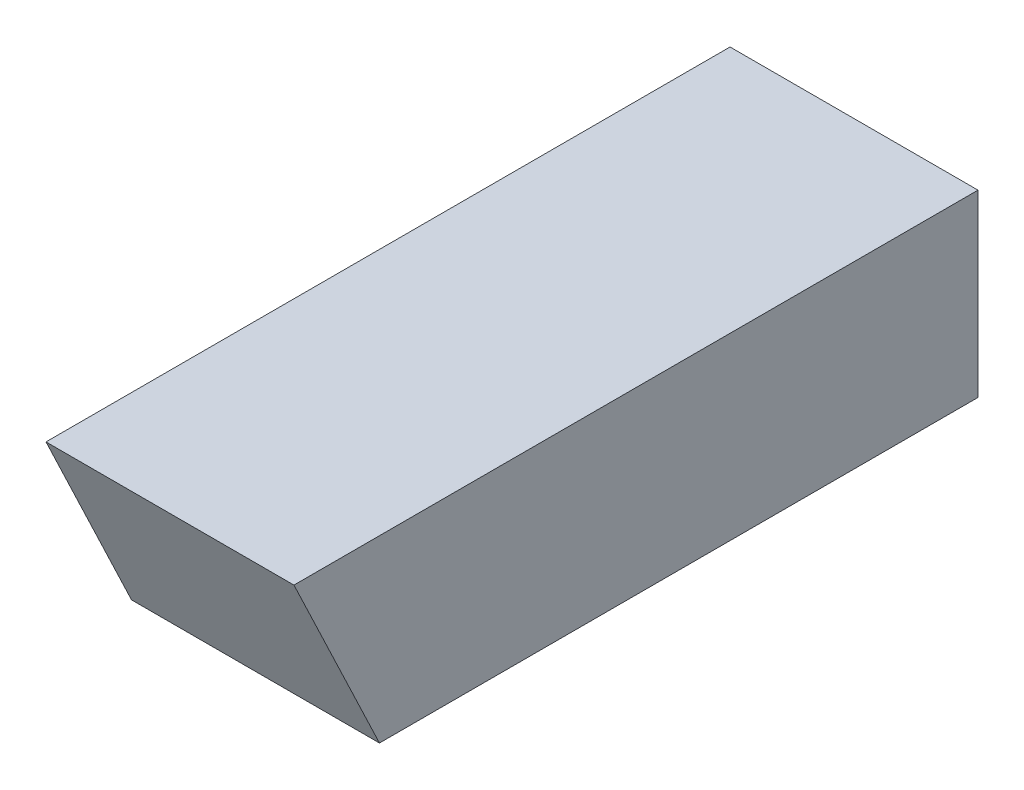
ISO-10303-21;
HEADER;
FILE_DESCRIPTION(('STEP AP214'),'2;1');
FILE_NAME('part.step','',(''),(''),'','','');
FILE_SCHEMA(('AUTOMOTIVE_DESIGN { 1 0 10303 214 1 1 1 1 }'));
ENDSEC;
DATA;
#1=APPLICATION_CONTEXT('core data for automotive mechanical design processes');
#2=APPLICATION_PROTOCOL_DEFINITION('international standard','automotive_design',2000,#1);
#3=PRODUCT_CONTEXT('',#1,'mechanical');
#4=PRODUCT('Part','Part','',(#3));
#5=PRODUCT_RELATED_PRODUCT_CATEGORY('part','',(#4));
#6=PRODUCT_DEFINITION_FORMATION('','',#4);
#7=PRODUCT_DEFINITION_CONTEXT('part definition',#1,'design');
#8=PRODUCT_DEFINITION('design','',#6,#7);
#9=PRODUCT_DEFINITION_SHAPE('','',#8);
#10=(LENGTH_UNIT() NAMED_UNIT(*) SI_UNIT(.MILLI.,.METRE.));
#11=(NAMED_UNIT(*) PLANE_ANGLE_UNIT() SI_UNIT($,.RADIAN.));
#12=(NAMED_UNIT(*) SI_UNIT($,.STERADIAN.) SOLID_ANGLE_UNIT());
#13=UNCERTAINTY_MEASURE_WITH_UNIT(LENGTH_MEASURE(1.E-05),#10,'distance_accuracy_value','');
#14=(GEOMETRIC_REPRESENTATION_CONTEXT(3) GLOBAL_UNCERTAINTY_ASSIGNED_CONTEXT((#13)) GLOBAL_UNIT_ASSIGNED_CONTEXT((#10,
#11,#12)) REPRESENTATION_CONTEXT('',''));
#15=CARTESIAN_POINT('',(0.,0.,0.));
#16=DIRECTION('',(0.,0.,1.));
#17=DIRECTION('',(1.,0.,0.));
#18=AXIS2_PLACEMENT_3D('',#15,#16,#17);
#19=CARTESIAN_POINT('',(145.,0.,350.));
#20=DIRECTION('',(0.,1.,0.));
#21=DIRECTION('',(0.,0.,1.));
#22=AXIS2_PLACEMENT_3D('',#19,#20,#21);
#23=PLANE('',#22);
#24=DIRECTION('',(0.,0.,-1.));
#25=VECTOR('',#24,1.);
#26=CARTESIAN_POINT('',(0.,0.,350.));
#27=LINE('',#26,#25);
#28=CARTESIAN_POINT('',(0.,0.,350.));
#29=VERTEX_POINT('',#28);
#30=CARTESIAN_POINT('',(0.,0.,0.));
#31=VERTEX_POINT('',#30);
#32=EDGE_CURVE('E166',#29,#31,#27,.T.);
#33=ORIENTED_EDGE('',*,*,#32,.T.);
#34=DIRECTION('',(-1.,0.,0.));
#35=VECTOR('',#34,1.);
#36=CARTESIAN_POINT('',(145.,0.,0.));
#37=LINE('',#36,#35);
#38=CARTESIAN_POINT('',(145.,0.,0.));
#39=VERTEX_POINT('',#38);
#40=EDGE_CURVE('E42',#39,#31,#37,.T.);
#41=ORIENTED_EDGE('',*,*,#40,.F.);
#42=DIRECTION('',(0.,0.,-1.));
#43=VECTOR('',#42,1.);
#44=CARTESIAN_POINT('',(145.,0.,350.));
#45=LINE('',#44,#43);
#46=CARTESIAN_POINT('',(145.,0.,350.));
#47=VERTEX_POINT('',#46);
#48=EDGE_CURVE('E156',#47,#39,#45,.T.);
#49=ORIENTED_EDGE('',*,*,#48,.F.);
#50=DIRECTION('',(-1.,0.,0.));
#51=VECTOR('',#50,1.);
#52=CARTESIAN_POINT('',(145.,0.,350.));
#53=LINE('',#52,#51);
#54=EDGE_CURVE('E11',#47,#29,#53,.T.);
#55=ORIENTED_EDGE('',*,*,#54,.T.);
#56=EDGE_LOOP('',(#33,#41,#49,#55));
#57=FACE_BOUND('',#56,.T.);
#58=CARTESIAN_POINT('',(72.5000000000003,0.,153.));
#59=DIRECTION('',(0.,-1.,0.));
#60=DIRECTION('',(0.,0.,-1.));
#61=AXIS2_PLACEMENT_3D('',#58,#59,#60);
#62=CIRCLE('',#61,2.55269999999996);
#63=CARTESIAN_POINT('',(72.5000000000003,0.,150.4473));
#64=VERTEX_POINT('',#63);
#65=EDGE_CURVE('E146',#64,#64,#62,.T.);
#66=ORIENTED_EDGE('',*,*,#65,.F.);
#67=EDGE_LOOP('',(#66));
#68=FACE_BOUND('',#67,.T.);
#69=CARTESIAN_POINT('',(72.5000000000002,0.,203.));
#70=DIRECTION('',(0.,-1.,0.));
#71=DIRECTION('',(0.,0.,-1.));
#72=AXIS2_PLACEMENT_3D('',#69,#70,#71);
#73=CIRCLE('',#72,2.55269999999996);
#74=CARTESIAN_POINT('',(72.5000000000002,0.,200.4473));
#75=VERTEX_POINT('',#74);
#76=EDGE_CURVE('E140',#75,#75,#73,.T.);
#77=ORIENTED_EDGE('',*,*,#76,.F.);
#78=EDGE_LOOP('',(#77));
#79=FACE_BOUND('',#78,.T.);
#80=CARTESIAN_POINT('',(72.5,0.,253.));
#81=DIRECTION('',(0.,-1.,0.));
#82=DIRECTION('',(0.,0.,-1.));
#83=AXIS2_PLACEMENT_3D('',#80,#81,#82);
#84=CIRCLE('',#83,2.55269999999996);
#85=CARTESIAN_POINT('',(72.5,0.,250.4473));
#86=VERTEX_POINT('',#85);
#87=EDGE_CURVE('E129',#86,#86,#84,.T.);
#88=ORIENTED_EDGE('',*,*,#87,.F.);
#89=EDGE_LOOP('',(#88));
#90=FACE_BOUND('',#89,.T.);
#91=DIRECTION('',(0.,0.,1.));
#92=VECTOR('',#91,1.);
#93=CARTESIAN_POINT('',(100.,0.,83.));
#94=LINE('',#93,#92);
#95=CARTESIAN_POINT('',(100.,0.,83.));
#96=VERTEX_POINT('',#95);
#97=CARTESIAN_POINT('',(100.,0.,113.));
#98=VERTEX_POINT('',#97);
#99=EDGE_CURVE('E128',#96,#98,#94,.T.);
#100=ORIENTED_EDGE('',*,*,#99,.F.);
#101=DIRECTION('',(1.,0.,0.));
#102=VECTOR('',#101,1.);
#103=CARTESIAN_POINT('',(45.,0.,83.));
#104=LINE('',#103,#102);
#105=CARTESIAN_POINT('',(45.,0.,83.));
#106=VERTEX_POINT('',#105);
#107=EDGE_CURVE('E125',#106,#96,#104,.T.);
#108=ORIENTED_EDGE('',*,*,#107,.F.);
#109=DIRECTION('',(0.,0.,-1.));
#110=VECTOR('',#109,1.);
#111=CARTESIAN_POINT('',(45.,0.,83.));
#112=LINE('',#111,#110);
#113=CARTESIAN_POINT('',(45.,0.,113.));
#114=VERTEX_POINT('',#113);
#115=EDGE_CURVE('E54',#114,#106,#112,.T.);
#116=ORIENTED_EDGE('',*,*,#115,.F.);
#117=DIRECTION('',(-1.,0.,0.));
#118=VECTOR('',#117,1.);
#119=CARTESIAN_POINT('',(45.,0.,113.));
#120=LINE('',#119,#118);
#121=EDGE_CURVE('E49',#98,#114,#120,.T.);
#122=ORIENTED_EDGE('',*,*,#121,.F.);
#123=EDGE_LOOP('',(#100,#108,#116,#122));
#124=FACE_BOUND('',#123,.T.);
#125=ADVANCED_FACE('F34',(#57,#68,#79,#90,#124),#23,.F.);
#126=CARTESIAN_POINT('',(145.,105.,400.));
#127=DIRECTION('',(0.,0.429933580392349,-0.90286051882393));
#128=DIRECTION('',(0.,0.90286051882393,0.429933580392349));
#129=AXIS2_PLACEMENT_3D('',#126,#127,#128);
#130=PLANE('',#129);
#131=DIRECTION('',(0.,-0.90286051882393,-0.429933580392349));
#132=VECTOR('',#131,1.);
#133=CARTESIAN_POINT('',(0.,105.,400.));
#134=LINE('',#133,#132);
#135=CARTESIAN_POINT('',(0.,105.,400.));
#136=VERTEX_POINT('',#135);
#137=EDGE_CURVE('E152',#136,#29,#134,.T.);
#138=ORIENTED_EDGE('',*,*,#137,.T.);
#139=ORIENTED_EDGE('',*,*,#54,.F.);
#140=DIRECTION('',(0.,-0.90286051882393,-0.429933580392349));
#141=VECTOR('',#140,1.);
#142=CARTESIAN_POINT('',(145.,105.,400.));
#143=LINE('',#142,#141);
#144=CARTESIAN_POINT('',(145.,105.,400.));
#145=VERTEX_POINT('',#144);
#146=EDGE_CURVE('E153',#145,#47,#143,.T.);
#147=ORIENTED_EDGE('',*,*,#146,.F.);
#148=DIRECTION('',(-1.,0.,0.));
#149=VECTOR('',#148,1.);
#150=CARTESIAN_POINT('',(145.,105.,400.));
#151=LINE('',#150,#149);
#152=EDGE_CURVE('E163',#145,#136,#151,.T.);
#153=ORIENTED_EDGE('',*,*,#152,.T.);
#154=EDGE_LOOP('',(#138,#139,#147,#153));
#155=FACE_BOUND('',#154,.T.);
#156=ADVANCED_FACE('F36',(#155),#130,.F.);
#157=CARTESIAN_POINT('',(145.,0.,0.));
#158=DIRECTION('',(0.,0.,1.));
#159=DIRECTION('',(1.,0.,0.));
#160=AXIS2_PLACEMENT_3D('',#157,#158,#159);
#161=PLANE('',#160);
#162=DIRECTION('',(0.,1.,0.));
#163=VECTOR('',#162,1.);
#164=CARTESIAN_POINT('',(0.,0.,0.));
#165=LINE('',#164,#163);
#166=CARTESIAN_POINT('',(0.,105.,0.));
#167=VERTEX_POINT('',#166);
#168=EDGE_CURVE('E168',#31,#167,#165,.T.);
#169=ORIENTED_EDGE('',*,*,#168,.T.);
#170=DIRECTION('',(-1.,0.,0.));
#171=VECTOR('',#170,1.);
#172=CARTESIAN_POINT('',(145.,105.,0.));
#173=LINE('',#172,#171);
#174=CARTESIAN_POINT('',(145.,105.,0.));
#175=VERTEX_POINT('',#174);
#176=EDGE_CURVE('E173',#175,#167,#173,.T.);
#177=ORIENTED_EDGE('',*,*,#176,.F.);
#178=DIRECTION('',(0.,1.,0.));
#179=VECTOR('',#178,1.);
#180=CARTESIAN_POINT('',(145.,0.,0.));
#181=LINE('',#180,#179);
#182=EDGE_CURVE('E159',#39,#175,#181,.T.);
#183=ORIENTED_EDGE('',*,*,#182,.F.);
#184=ORIENTED_EDGE('',*,*,#40,.T.);
#185=EDGE_LOOP('',(#169,#177,#183,#184));
#186=FACE_BOUND('',#185,.T.);
#187=ADVANCED_FACE('F180',(#186),#161,.F.);
#188=CARTESIAN_POINT('',(145.,105.,0.));
#189=DIRECTION('',(0.,-1.,0.));
#190=DIRECTION('',(0.,0.,-1.));
#191=AXIS2_PLACEMENT_3D('',#188,#189,#190);
#192=PLANE('',#191);
#193=DIRECTION('',(0.,0.,1.));
#194=VECTOR('',#193,1.);
#195=CARTESIAN_POINT('',(0.,105.,0.));
#196=LINE('',#195,#194);
#197=EDGE_CURVE('E157',#167,#136,#196,.T.);
#198=ORIENTED_EDGE('',*,*,#197,.T.);
#199=ORIENTED_EDGE('',*,*,#152,.F.);
#200=DIRECTION('',(0.,0.,1.));
#201=VECTOR('',#200,1.);
#202=CARTESIAN_POINT('',(145.,105.,0.));
#203=LINE('',#202,#201);
#204=EDGE_CURVE('E161',#175,#145,#203,.T.);
#205=ORIENTED_EDGE('',*,*,#204,.F.);
#206=ORIENTED_EDGE('',*,*,#176,.T.);
#207=EDGE_LOOP('',(#198,#199,#205,#206));
#208=FACE_BOUND('',#207,.T.);
#209=ADVANCED_FACE('F189',(#208),#192,.F.);
#210=CARTESIAN_POINT('',(145.,0.,0.));
#211=DIRECTION('',(1.,0.,0.));
#212=DIRECTION('',(0.,0.,-1.));
#213=AXIS2_PLACEMENT_3D('',#210,#211,#212);
#214=PLANE('',#213);
#215=ORIENTED_EDGE('',*,*,#146,.T.);
#216=ORIENTED_EDGE('',*,*,#48,.T.);
#217=ORIENTED_EDGE('',*,*,#182,.T.);
#218=ORIENTED_EDGE('',*,*,#204,.T.);
#219=EDGE_LOOP('',(#215,#216,#217,#218));
#220=FACE_BOUND('',#219,.T.);
#221=ADVANCED_FACE('F195',(#220),#214,.T.);
#222=CARTESIAN_POINT('',(0.,0.,0.));
#223=DIRECTION('',(1.,0.,0.));
#224=DIRECTION('',(0.,0.,-1.));
#225=AXIS2_PLACEMENT_3D('',#222,#223,#224);
#226=PLANE('',#225);
#227=ORIENTED_EDGE('',*,*,#137,.F.);
#228=ORIENTED_EDGE('',*,*,#197,.F.);
#229=ORIENTED_EDGE('',*,*,#168,.F.);
#230=ORIENTED_EDGE('',*,*,#32,.F.);
#231=EDGE_LOOP('',(#227,#228,#229,#230));
#232=FACE_BOUND('',#231,.T.);
#233=ADVANCED_FACE('F186',(#232),#226,.F.);
#234=CARTESIAN_POINT('',(72.5000000000003,8.00000000000001,153.));
#235=DIRECTION('',(0.,-1.,0.));
#236=DIRECTION('',(0.,0.,-1.));
#237=AXIS2_PLACEMENT_3D('',#234,#235,#236);
#238=CONICAL_SURFACE('',#237,2.55269999999996,1.02974425867665);
#239=CARTESIAN_POINT('',(72.5000000000003,9.53381690219165,153.));
#240=VERTEX_POINT('',#239);
#241=VERTEX_LOOP('',#240);
#242=FACE_BOUND('',#241,.T.);
#243=CARTESIAN_POINT('',(72.5000000000003,8.00000000000001,153.));
#244=DIRECTION('',(0.,-1.,0.));
#245=DIRECTION('',(0.,0.,-1.));
#246=AXIS2_PLACEMENT_3D('',#243,#244,#245);
#247=CIRCLE('',#246,2.55269999999996);
#248=CARTESIAN_POINT('',(72.5000000000003,8.00000000000001,150.4473));
#249=VERTEX_POINT('',#248);
#250=EDGE_CURVE('E149',#249,#249,#247,.T.);
#251=ORIENTED_EDGE('',*,*,#250,.T.);
#252=EDGE_LOOP('',(#251));
#253=FACE_BOUND('',#252,.T.);
#254=ADVANCED_FACE('F249',(#242,#253),#238,.F.);
#255=CARTESIAN_POINT('',(72.5000000000003,0.,153.));
#256=DIRECTION('',(0.,-1.,0.));
#257=DIRECTION('',(0.,0.,-1.));
#258=AXIS2_PLACEMENT_3D('',#255,#256,#257);
#259=CYLINDRICAL_SURFACE('',#258,2.55269999999996);
#260=ORIENTED_EDGE('',*,*,#250,.F.);
#261=EDGE_LOOP('',(#260));
#262=FACE_BOUND('',#261,.T.);
#263=ORIENTED_EDGE('',*,*,#65,.T.);
#264=EDGE_LOOP('',(#263));
#265=FACE_BOUND('',#264,.T.);
#266=ADVANCED_FACE('F245',(#262,#265),#259,.F.);
#267=CARTESIAN_POINT('',(72.5000000000002,8.00000000000001,203.));
#268=DIRECTION('',(0.,-1.,0.));
#269=DIRECTION('',(0.,0.,-1.));
#270=AXIS2_PLACEMENT_3D('',#267,#268,#269);
#271=CONICAL_SURFACE('',#270,2.55269999999996,1.02974425867665);
#272=CARTESIAN_POINT('',(72.5000000000002,9.53381690219165,203.));
#273=VERTEX_POINT('',#272);
#274=VERTEX_LOOP('',#273);
#275=FACE_BOUND('',#274,.T.);
#276=CARTESIAN_POINT('',(72.5000000000002,8.00000000000001,203.));
#277=DIRECTION('',(0.,-1.,0.));
#278=DIRECTION('',(0.,0.,-1.));
#279=AXIS2_PLACEMENT_3D('',#276,#277,#278);
#280=CIRCLE('',#279,2.55269999999996);
#281=CARTESIAN_POINT('',(72.5000000000002,8.00000000000001,200.4473));
#282=VERTEX_POINT('',#281);
#283=EDGE_CURVE('E143',#282,#282,#280,.T.);
#284=ORIENTED_EDGE('',*,*,#283,.T.);
#285=EDGE_LOOP('',(#284));
#286=FACE_BOUND('',#285,.T.);
#287=ADVANCED_FACE('F241',(#275,#286),#271,.F.);
#288=CARTESIAN_POINT('',(72.5000000000002,0.,203.));
#289=DIRECTION('',(0.,-1.,0.));
#290=DIRECTION('',(0.,0.,-1.));
#291=AXIS2_PLACEMENT_3D('',#288,#289,#290);
#292=CYLINDRICAL_SURFACE('',#291,2.55269999999996);
#293=ORIENTED_EDGE('',*,*,#283,.F.);
#294=EDGE_LOOP('',(#293));
#295=FACE_BOUND('',#294,.T.);
#296=ORIENTED_EDGE('',*,*,#76,.T.);
#297=EDGE_LOOP('',(#296));
#298=FACE_BOUND('',#297,.T.);
#299=ADVANCED_FACE('F237',(#295,#298),#292,.F.);
#300=CARTESIAN_POINT('',(72.5,8.00000000000001,253.));
#301=DIRECTION('',(0.,-1.,0.));
#302=DIRECTION('',(0.,0.,-1.));
#303=AXIS2_PLACEMENT_3D('',#300,#301,#302);
#304=CONICAL_SURFACE('',#303,2.55269999999996,1.02974425867665);
#305=CARTESIAN_POINT('',(72.5,9.53381690219165,253.));
#306=VERTEX_POINT('',#305);
#307=VERTEX_LOOP('',#306);
#308=FACE_BOUND('',#307,.T.);
#309=CARTESIAN_POINT('',(72.5,8.00000000000001,253.));
#310=DIRECTION('',(0.,-1.,0.));
#311=DIRECTION('',(0.,0.,-1.));
#312=AXIS2_PLACEMENT_3D('',#309,#310,#311);
#313=CIRCLE('',#312,2.55269999999996);
#314=CARTESIAN_POINT('',(72.5,8.00000000000001,250.4473));
#315=VERTEX_POINT('',#314);
#316=EDGE_CURVE('E132',#315,#315,#313,.T.);
#317=ORIENTED_EDGE('',*,*,#316,.T.);
#318=EDGE_LOOP('',(#317));
#319=FACE_BOUND('',#318,.T.);
#320=ADVANCED_FACE('F233',(#308,#319),#304,.F.);
#321=CARTESIAN_POINT('',(72.5,0.,253.));
#322=DIRECTION('',(0.,-1.,0.));
#323=DIRECTION('',(0.,0.,-1.));
#324=AXIS2_PLACEMENT_3D('',#321,#322,#323);
#325=CYLINDRICAL_SURFACE('',#324,2.55269999999996);
#326=ORIENTED_EDGE('',*,*,#316,.F.);
#327=EDGE_LOOP('',(#326));
#328=FACE_BOUND('',#327,.T.);
#329=ORIENTED_EDGE('',*,*,#87,.T.);
#330=EDGE_LOOP('',(#329));
#331=FACE_BOUND('',#330,.T.);
#332=ADVANCED_FACE('F230',(#328,#331),#325,.F.);
#333=CARTESIAN_POINT('',(100.,-30.,83.));
#334=DIRECTION('',(-1.,0.,0.));
#335=DIRECTION('',(0.,0.,1.));
#336=AXIS2_PLACEMENT_3D('',#333,#334,#335);
#337=PLANE('',#336);
#338=ORIENTED_EDGE('',*,*,#99,.T.);
#339=DIRECTION('',(0.,1.,0.));
#340=VECTOR('',#339,1.);
#341=CARTESIAN_POINT('',(100.,-30.,113.));
#342=LINE('',#341,#340);
#343=CARTESIAN_POINT('',(100.,-30.,113.));
#344=VERTEX_POINT('',#343);
#345=EDGE_CURVE('E109',#344,#98,#342,.T.);
#346=ORIENTED_EDGE('',*,*,#345,.F.);
#347=DIRECTION('',(0.,0.,1.));
#348=VECTOR('',#347,1.);
#349=CARTESIAN_POINT('',(100.,-30.,83.));
#350=LINE('',#349,#348);
#351=CARTESIAN_POINT('',(100.,-30.,83.));
#352=VERTEX_POINT('',#351);
#353=EDGE_CURVE('E116',#352,#344,#350,.T.);
#354=ORIENTED_EDGE('',*,*,#353,.F.);
#355=DIRECTION('',(0.,1.,0.));
#356=VECTOR('',#355,1.);
#357=CARTESIAN_POINT('',(100.,-30.,83.));
#358=LINE('',#357,#356);
#359=EDGE_CURVE('E208',#352,#96,#358,.T.);
#360=ORIENTED_EDGE('',*,*,#359,.T.);
#361=EDGE_LOOP('',(#338,#346,#354,#360));
#362=FACE_BOUND('',#361,.T.);
#363=ADVANCED_FACE('F127',(#362),#337,.F.);
#364=CARTESIAN_POINT('',(45.,-30.,113.));
#365=DIRECTION('',(0.,0.,-1.));
#366=DIRECTION('',(-1.,0.,0.));
#367=AXIS2_PLACEMENT_3D('',#364,#365,#366);
#368=PLANE('',#367);
#369=ORIENTED_EDGE('',*,*,#121,.T.);
#370=DIRECTION('',(0.,1.,0.));
#371=VECTOR('',#370,1.);
#372=CARTESIAN_POINT('',(45.,-30.,113.));
#373=LINE('',#372,#371);
#374=CARTESIAN_POINT('',(45.,-30.,113.));
#375=VERTEX_POINT('',#374);
#376=EDGE_CURVE('E112',#375,#114,#373,.T.);
#377=ORIENTED_EDGE('',*,*,#376,.F.);
#378=DIRECTION('',(-1.,0.,0.));
#379=VECTOR('',#378,1.);
#380=CARTESIAN_POINT('',(45.,-30.,113.));
#381=LINE('',#380,#379);
#382=EDGE_CURVE('E105',#344,#375,#381,.T.);
#383=ORIENTED_EDGE('',*,*,#382,.F.);
#384=ORIENTED_EDGE('',*,*,#345,.T.);
#385=EDGE_LOOP('',(#369,#377,#383,#384));
#386=FACE_BOUND('',#385,.T.);
#387=ADVANCED_FACE('F107',(#386),#368,.F.);
#388=CARTESIAN_POINT('',(45.,-30.,83.));
#389=DIRECTION('',(1.,0.,0.));
#390=DIRECTION('',(0.,0.,-1.));
#391=AXIS2_PLACEMENT_3D('',#388,#389,#390);
#392=PLANE('',#391);
#393=ORIENTED_EDGE('',*,*,#115,.T.);
#394=DIRECTION('',(0.,1.,0.));
#395=VECTOR('',#394,1.);
#396=CARTESIAN_POINT('',(45.,-30.,83.));
#397=LINE('',#396,#395);
#398=CARTESIAN_POINT('',(45.,-30.,83.));
#399=VERTEX_POINT('',#398);
#400=EDGE_CURVE('E134',#399,#106,#397,.T.);
#401=ORIENTED_EDGE('',*,*,#400,.F.);
#402=DIRECTION('',(0.,0.,-1.));
#403=VECTOR('',#402,1.);
#404=CARTESIAN_POINT('',(45.,-30.,83.));
#405=LINE('',#404,#403);
#406=EDGE_CURVE('E115',#375,#399,#405,.T.);
#407=ORIENTED_EDGE('',*,*,#406,.F.);
#408=ORIENTED_EDGE('',*,*,#376,.T.);
#409=EDGE_LOOP('',(#393,#401,#407,#408));
#410=FACE_BOUND('',#409,.T.);
#411=ADVANCED_FACE('F217',(#410),#392,.F.);
#412=CARTESIAN_POINT('',(45.,-30.,83.));
#413=DIRECTION('',(0.,0.,1.));
#414=DIRECTION('',(1.,0.,0.));
#415=AXIS2_PLACEMENT_3D('',#412,#413,#414);
#416=PLANE('',#415);
#417=ORIENTED_EDGE('',*,*,#107,.T.);
#418=ORIENTED_EDGE('',*,*,#359,.F.);
#419=DIRECTION('',(1.,0.,0.));
#420=VECTOR('',#419,1.);
#421=CARTESIAN_POINT('',(45.,-30.,83.));
#422=LINE('',#421,#420);
#423=EDGE_CURVE('E121',#399,#352,#422,.T.);
#424=ORIENTED_EDGE('',*,*,#423,.F.);
#425=ORIENTED_EDGE('',*,*,#400,.T.);
#426=EDGE_LOOP('',(#417,#418,#424,#425));
#427=FACE_BOUND('',#426,.T.);
#428=ADVANCED_FACE('F207',(#427),#416,.F.);
#429=CARTESIAN_POINT('',(0.,-30.,0.));
#430=DIRECTION('',(0.,1.,0.));
#431=DIRECTION('',(0.,0.,1.));
#432=AXIS2_PLACEMENT_3D('',#429,#430,#431);
#433=PLANE('',#432);
#434=ORIENTED_EDGE('',*,*,#353,.T.);
#435=ORIENTED_EDGE('',*,*,#382,.T.);
#436=ORIENTED_EDGE('',*,*,#406,.T.);
#437=ORIENTED_EDGE('',*,*,#423,.T.);
#438=EDGE_LOOP('',(#434,#435,#436,#437));
#439=FACE_BOUND('',#438,.T.);
#440=ADVANCED_FACE('F119',(#439),#433,.F.);
#441=CLOSED_SHELL('',(#125,#156,#187,#209,#221,#233,#254,#266,#287,#299,#320,#332,#363,#387,
#411,#428,#440));
#442=MANIFOLD_SOLID_BREP('B2',#441);
#443=ADVANCED_BREP_SHAPE_REPRESENTATION('',(#18,#442),#14);
#444=SHAPE_DEFINITION_REPRESENTATION(#9,#443);
ENDSEC;
END-ISO-10303-21;
